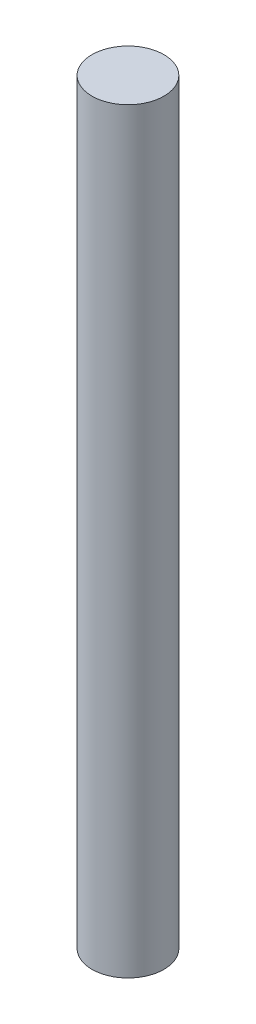
ISO-10303-21;
HEADER;
FILE_DESCRIPTION(('STEP AP214'),'2;1');
FILE_NAME('part.step','',(''),(''),'','','');
FILE_SCHEMA(('AUTOMOTIVE_DESIGN { 1 0 10303 214 1 1 1 1 }'));
ENDSEC;
DATA;
#1=APPLICATION_CONTEXT('core data for automotive mechanical design processes');
#2=APPLICATION_PROTOCOL_DEFINITION('international standard','automotive_design',2000,#1);
#3=PRODUCT_CONTEXT('',#1,'mechanical');
#4=PRODUCT('Part','Part','',(#3));
#5=PRODUCT_RELATED_PRODUCT_CATEGORY('part','',(#4));
#6=PRODUCT_DEFINITION_FORMATION('','',#4);
#7=PRODUCT_DEFINITION_CONTEXT('part definition',#1,'design');
#8=PRODUCT_DEFINITION('design','',#6,#7);
#9=PRODUCT_DEFINITION_SHAPE('','',#8);
#10=(LENGTH_UNIT() NAMED_UNIT(*) SI_UNIT(.MILLI.,.METRE.));
#11=(NAMED_UNIT(*) PLANE_ANGLE_UNIT() SI_UNIT($,.RADIAN.));
#12=(NAMED_UNIT(*) SI_UNIT($,.STERADIAN.) SOLID_ANGLE_UNIT());
#13=UNCERTAINTY_MEASURE_WITH_UNIT(LENGTH_MEASURE(1.E-05),#10,'distance_accuracy_value','');
#14=(GEOMETRIC_REPRESENTATION_CONTEXT(3) GLOBAL_UNCERTAINTY_ASSIGNED_CONTEXT((#13)) GLOBAL_UNIT_ASSIGNED_CONTEXT((#10,
#11,#12)) REPRESENTATION_CONTEXT('',''));
#15=CARTESIAN_POINT('',(0.,0.,0.));
#16=DIRECTION('',(0.,0.,1.));
#17=DIRECTION('',(1.,0.,0.));
#18=AXIS2_PLACEMENT_3D('',#15,#16,#17);
#19=CARTESIAN_POINT('',(0.,21.02,0.));
#20=DIRECTION('',(0.,-1.,0.));
#21=DIRECTION('',(0.,0.,-1.));
#22=AXIS2_PLACEMENT_3D('',#19,#20,#21);
#23=CYLINDRICAL_SURFACE('',#22,1.);
#24=CARTESIAN_POINT('',(0.,21.02,0.));
#25=DIRECTION('',(0.,1.,0.));
#26=DIRECTION('',(0.,0.,1.));
#27=AXIS2_PLACEMENT_3D('',#24,#25,#26);
#28=CIRCLE('',#27,1.);
#29=CARTESIAN_POINT('',(0.,21.02,1.));
#30=VERTEX_POINT('',#29);
#31=EDGE_CURVE('E10',#30,#30,#28,.T.);
#32=ORIENTED_EDGE('',*,*,#31,.F.);
#33=EDGE_LOOP('',(#32));
#34=FACE_BOUND('',#33,.T.);
#35=CARTESIAN_POINT('',(0.,0.,0.));
#36=DIRECTION('',(0.,1.,0.));
#37=DIRECTION('',(0.,0.,1.));
#38=AXIS2_PLACEMENT_3D('',#35,#36,#37);
#39=CIRCLE('',#38,1.);
#40=CARTESIAN_POINT('',(0.,0.,1.));
#41=VERTEX_POINT('',#40);
#42=EDGE_CURVE('E34',#41,#41,#39,.T.);
#43=ORIENTED_EDGE('',*,*,#42,.T.);
#44=EDGE_LOOP('',(#43));
#45=FACE_BOUND('',#44,.T.);
#46=ADVANCED_FACE('F31',(#34,#45),#23,.T.);
#47=CARTESIAN_POINT('',(0.,21.02,0.));
#48=DIRECTION('',(0.,1.,0.));
#49=DIRECTION('',(0.,0.,1.));
#50=AXIS2_PLACEMENT_3D('',#47,#48,#49);
#51=PLANE('',#50);
#52=ORIENTED_EDGE('',*,*,#31,.T.);
#53=EDGE_LOOP('',(#52));
#54=FACE_BOUND('',#53,.T.);
#55=ADVANCED_FACE('F46',(#54),#51,.T.);
#56=CARTESIAN_POINT('',(0.,0.,0.));
#57=DIRECTION('',(0.,1.,0.));
#58=DIRECTION('',(0.,0.,1.));
#59=AXIS2_PLACEMENT_3D('',#56,#57,#58);
#60=PLANE('',#59);
#61=ORIENTED_EDGE('',*,*,#42,.F.);
#62=EDGE_LOOP('',(#61));
#63=FACE_BOUND('',#62,.T.);
#64=ADVANCED_FACE('F44',(#63),#60,.F.);
#65=CLOSED_SHELL('',(#46,#55,#64));
#66=MANIFOLD_SOLID_BREP('B2',#65);
#67=ADVANCED_BREP_SHAPE_REPRESENTATION('',(#18,#66),#14);
#68=SHAPE_DEFINITION_REPRESENTATION(#9,#67);
ENDSEC;
END-ISO-10303-21;
